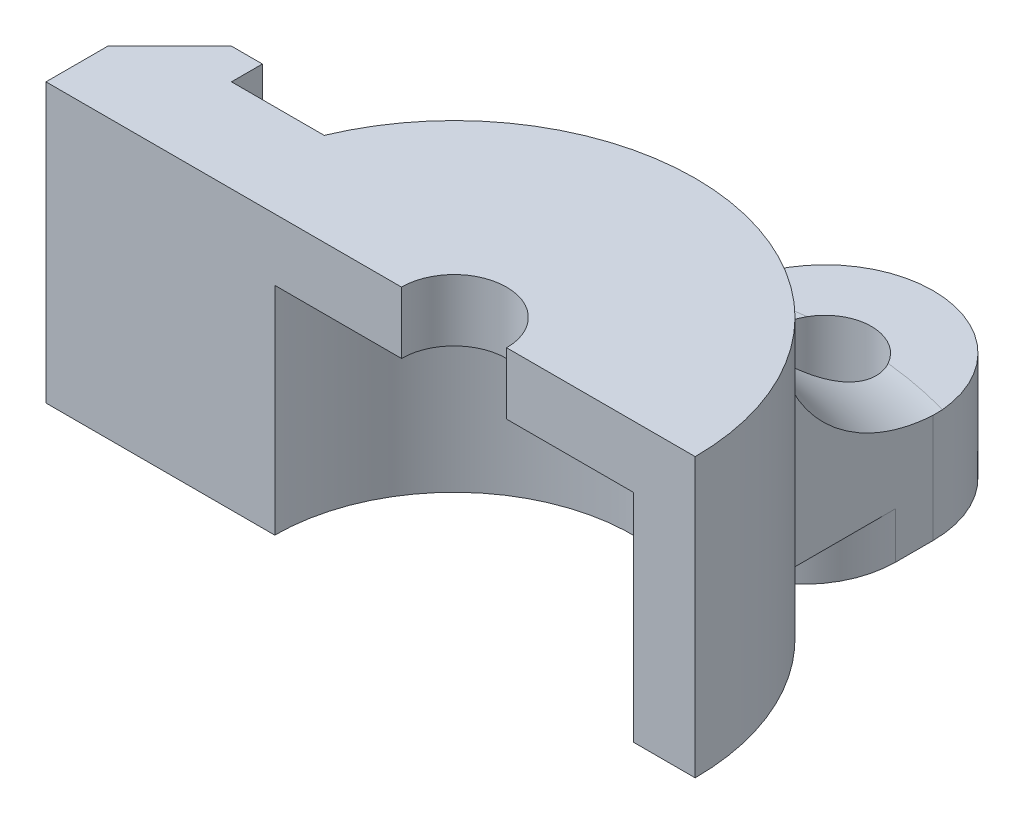
ISO-10303-21;
HEADER;
FILE_DESCRIPTION(('STEP AP214'),'2;1');
FILE_NAME('part.step','',(''),(''),'','','');
FILE_SCHEMA(('AUTOMOTIVE_DESIGN { 1 0 10303 214 1 1 1 1 }'));
ENDSEC;
DATA;
#1=APPLICATION_CONTEXT('core data for automotive mechanical design processes');
#2=APPLICATION_PROTOCOL_DEFINITION('international standard','automotive_design',2000,#1);
#3=PRODUCT_CONTEXT('',#1,'mechanical');
#4=PRODUCT('Part','Part','',(#3));
#5=PRODUCT_RELATED_PRODUCT_CATEGORY('part','',(#4));
#6=PRODUCT_DEFINITION_FORMATION('','',#4);
#7=PRODUCT_DEFINITION_CONTEXT('part definition',#1,'design');
#8=PRODUCT_DEFINITION('design','',#6,#7);
#9=PRODUCT_DEFINITION_SHAPE('','',#8);
#10=(LENGTH_UNIT() NAMED_UNIT(*) SI_UNIT(.MILLI.,.METRE.));
#11=(NAMED_UNIT(*) PLANE_ANGLE_UNIT() SI_UNIT($,.RADIAN.));
#12=(NAMED_UNIT(*) SI_UNIT($,.STERADIAN.) SOLID_ANGLE_UNIT());
#13=UNCERTAINTY_MEASURE_WITH_UNIT(LENGTH_MEASURE(1.E-05),#10,'distance_accuracy_value','');
#14=(GEOMETRIC_REPRESENTATION_CONTEXT(3) GLOBAL_UNCERTAINTY_ASSIGNED_CONTEXT((#13)) GLOBAL_UNIT_ASSIGNED_CONTEXT((#10,
#11,#12)) REPRESENTATION_CONTEXT('',''));
#15=CARTESIAN_POINT('',(0.,0.,0.));
#16=DIRECTION('',(0.,0.,1.));
#17=DIRECTION('',(1.,0.,0.));
#18=AXIS2_PLACEMENT_3D('',#15,#16,#17);
#19=CARTESIAN_POINT('',(0.,7.,0.));
#20=DIRECTION('',(0.,-1.,0.));
#21=DIRECTION('',(0.,0.,-1.));
#22=AXIS2_PLACEMENT_3D('',#19,#20,#21);
#23=CYLINDRICAL_SURFACE('',#22,7.8);
#24=CARTESIAN_POINT('',(0.,0.,0.));
#25=DIRECTION('',(0.,1.,0.));
#26=DIRECTION('',(0.,0.,1.));
#27=AXIS2_PLACEMENT_3D('',#24,#25,#26);
#28=CIRCLE('',#27,7.8);
#29=CARTESIAN_POINT('',(-3.5,0.,-6.97065276713738));
#30=VERTEX_POINT('',#29);
#31=CARTESIAN_POINT('',(-7.2,0.,-3.));
#32=VERTEX_POINT('',#31);
#33=EDGE_CURVE('E205',#30,#32,#28,.T.);
#34=ORIENTED_EDGE('',*,*,#33,.T.);
#35=DIRECTION('',(0.,1.,0.));
#36=VECTOR('',#35,1.);
#37=CARTESIAN_POINT('',(-7.2,-7.21110255092798,-3.));
#38=LINE('',#37,#36);
#39=CARTESIAN_POINT('',(-7.2,9.,-3.));
#40=VERTEX_POINT('',#39);
#41=EDGE_CURVE('E189',#32,#40,#38,.T.);
#42=ORIENTED_EDGE('',*,*,#41,.T.);
#43=CARTESIAN_POINT('',(0.,9.,0.));
#44=DIRECTION('',(0.,1.,0.));
#45=DIRECTION('',(0.,0.,1.));
#46=AXIS2_PLACEMENT_3D('',#43,#44,#45);
#47=CIRCLE('',#46,7.8);
#48=CARTESIAN_POINT('',(7.8,9.,0.));
#49=VERTEX_POINT('',#48);
#50=EDGE_CURVE('E203',#49,#40,#47,.T.);
#51=ORIENTED_EDGE('',*,*,#50,.F.);
#52=DIRECTION('',(0.,-1.,0.));
#53=VECTOR('',#52,1.);
#54=CARTESIAN_POINT('',(7.8,7.,0.));
#55=LINE('',#54,#53);
#56=CARTESIAN_POINT('',(7.8,0.,0.));
#57=VERTEX_POINT('',#56);
#58=EDGE_CURVE('E250',#49,#57,#55,.T.);
#59=ORIENTED_EDGE('',*,*,#58,.T.);
#60=CARTESIAN_POINT('',(3.5,0.,-6.97065276713738));
#61=VERTEX_POINT('',#60);
#62=EDGE_CURVE('E252',#57,#61,#28,.T.);
#63=ORIENTED_EDGE('',*,*,#62,.T.);
#64=DIRECTION('',(0.,-1.,0.));
#65=VECTOR('',#64,1.);
#66=CARTESIAN_POINT('',(3.5,2.,-6.97065276713738));
#67=LINE('',#66,#65);
#68=CARTESIAN_POINT('',(3.5,7.,-6.97065276713738));
#69=VERTEX_POINT('',#68);
#70=EDGE_CURVE('E658',#69,#61,#67,.T.);
#71=ORIENTED_EDGE('',*,*,#70,.F.);
#72=CARTESIAN_POINT('',(0.,7.,0.));
#73=DIRECTION('',(0.,-1.,0.));
#74=DIRECTION('',(0.,0.,-1.));
#75=AXIS2_PLACEMENT_3D('',#72,#73,#74);
#76=CIRCLE('',#75,7.8);
#77=CARTESIAN_POINT('',(-3.5,7.,-6.97065276713738));
#78=VERTEX_POINT('',#77);
#79=EDGE_CURVE('E282',#69,#78,#76,.F.);
#80=ORIENTED_EDGE('',*,*,#79,.T.);
#81=DIRECTION('',(0.,-1.,0.));
#82=VECTOR('',#81,1.);
#83=CARTESIAN_POINT('',(-3.5,2.,-6.97065276713738));
#84=LINE('',#83,#82);
#85=EDGE_CURVE('E236',#78,#30,#84,.T.);
#86=ORIENTED_EDGE('',*,*,#85,.T.);
#87=EDGE_LOOP('',(#34,#42,#51,#59,#63,#71,#80,#86));
#88=FACE_BOUND('',#87,.T.);
#89=ADVANCED_FACE('F42',(#88),#23,.T.);
#90=CARTESIAN_POINT('',(-7.8,7.,0.));
#91=DIRECTION('',(0.,0.,-1.));
#92=DIRECTION('',(-1.,0.,0.));
#93=AXIS2_PLACEMENT_3D('',#90,#91,#92);
#94=PLANE('',#93);
#95=DIRECTION('',(1.,0.,0.));
#96=VECTOR('',#95,1.);
#97=CARTESIAN_POINT('',(-7.8,0.,0.));
#98=LINE('',#97,#96);
#99=CARTESIAN_POINT('',(-13.2,0.,0.));
#100=VERTEX_POINT('',#99);
#101=CARTESIAN_POINT('',(-5.8,0.,0.));
#102=VERTEX_POINT('',#101);
#103=EDGE_CURVE('E256',#100,#102,#98,.T.);
#104=ORIENTED_EDGE('',*,*,#103,.T.);
#105=DIRECTION('',(0.,-1.,0.));
#106=VECTOR('',#105,1.);
#107=CARTESIAN_POINT('',(-5.8,7.,0.));
#108=LINE('',#107,#106);
#109=CARTESIAN_POINT('',(-5.8,7.,0.));
#110=VERTEX_POINT('',#109);
#111=EDGE_CURVE('E271',#110,#102,#108,.T.);
#112=ORIENTED_EDGE('',*,*,#111,.F.);
#113=DIRECTION('',(1.,0.,0.));
#114=VECTOR('',#113,1.);
#115=CARTESIAN_POINT('',(-7.8,7.,0.));
#116=LINE('',#115,#114);
#117=CARTESIAN_POINT('',(-1.7,7.,0.));
#118=VERTEX_POINT('',#117);
#119=EDGE_CURVE('E233',#110,#118,#116,.T.);
#120=ORIENTED_EDGE('',*,*,#119,.T.);
#121=DIRECTION('',(0.,-1.,0.));
#122=VECTOR('',#121,1.);
#123=CARTESIAN_POINT('',(-1.7,9.,0.));
#124=LINE('',#123,#122);
#125=CARTESIAN_POINT('',(-1.7,9.,0.));
#126=VERTEX_POINT('',#125);
#127=EDGE_CURVE('E242',#126,#118,#124,.T.);
#128=ORIENTED_EDGE('',*,*,#127,.F.);
#129=DIRECTION('',(1.,0.,0.));
#130=VECTOR('',#129,1.);
#131=CARTESIAN_POINT('',(-7.8,9.,0.));
#132=LINE('',#131,#130);
#133=CARTESIAN_POINT('',(-13.2,9.,0.));
#134=VERTEX_POINT('',#133);
#135=EDGE_CURVE('E214',#134,#126,#132,.T.);
#136=ORIENTED_EDGE('',*,*,#135,.F.);
#137=DIRECTION('',(0.,1.,0.));
#138=VECTOR('',#137,1.);
#139=CARTESIAN_POINT('',(-13.2,-7.21110255092798,0.));
#140=LINE('',#139,#138);
#141=EDGE_CURVE('E729',#100,#134,#140,.T.);
#142=ORIENTED_EDGE('',*,*,#141,.F.);
#143=EDGE_LOOP('',(#104,#112,#120,#128,#136,#142));
#144=FACE_BOUND('',#143,.T.);
#145=ADVANCED_FACE('F387',(#144),#94,.F.);
#146=CARTESIAN_POINT('',(0.,7.,0.));
#147=DIRECTION('',(0.,-1.,0.));
#148=DIRECTION('',(0.,0.,-1.));
#149=AXIS2_PLACEMENT_3D('',#146,#147,#148);
#150=CYLINDRICAL_SURFACE('',#149,5.8);
#151=CARTESIAN_POINT('',(0.,0.,0.));
#152=DIRECTION('',(0.,-1.,0.));
#153=DIRECTION('',(0.,0.,1.));
#154=AXIS2_PLACEMENT_3D('',#151,#152,#153);
#155=CIRCLE('',#154,5.8);
#156=CARTESIAN_POINT('',(5.8,0.,0.));
#157=VERTEX_POINT('',#156);
#158=EDGE_CURVE('E260',#102,#157,#155,.T.);
#159=ORIENTED_EDGE('',*,*,#158,.T.);
#160=DIRECTION('',(0.,-1.,0.));
#161=VECTOR('',#160,1.);
#162=CARTESIAN_POINT('',(5.8,7.,0.));
#163=LINE('',#162,#161);
#164=CARTESIAN_POINT('',(5.8,7.,0.));
#165=VERTEX_POINT('',#164);
#166=EDGE_CURVE('E267',#165,#157,#163,.T.);
#167=ORIENTED_EDGE('',*,*,#166,.F.);
#168=CARTESIAN_POINT('',(0.,7.,0.));
#169=DIRECTION('',(0.,-1.,0.));
#170=DIRECTION('',(0.,0.,1.));
#171=AXIS2_PLACEMENT_3D('',#168,#169,#170);
#172=CIRCLE('',#171,5.8);
#173=EDGE_CURVE('E246',#110,#165,#172,.T.);
#174=ORIENTED_EDGE('',*,*,#173,.F.);
#175=ORIENTED_EDGE('',*,*,#111,.T.);
#176=EDGE_LOOP('',(#159,#167,#174,#175));
#177=FACE_BOUND('',#176,.T.);
#178=ADVANCED_FACE('F393',(#177),#150,.F.);
#179=CARTESIAN_POINT('',(5.8,7.,0.));
#180=DIRECTION('',(0.,0.,-1.));
#181=DIRECTION('',(-1.,0.,0.));
#182=AXIS2_PLACEMENT_3D('',#179,#180,#181);
#183=PLANE('',#182);
#184=DIRECTION('',(1.,0.,0.));
#185=VECTOR('',#184,1.);
#186=CARTESIAN_POINT('',(5.8,0.,0.));
#187=LINE('',#186,#185);
#188=EDGE_CURVE('E251',#157,#57,#187,.T.);
#189=ORIENTED_EDGE('',*,*,#188,.T.);
#190=ORIENTED_EDGE('',*,*,#58,.F.);
#191=DIRECTION('',(1.,0.,0.));
#192=VECTOR('',#191,1.);
#193=CARTESIAN_POINT('',(7.8,9.,0.));
#194=LINE('',#193,#192);
#195=CARTESIAN_POINT('',(1.7,9.,0.));
#196=VERTEX_POINT('',#195);
#197=EDGE_CURVE('E212',#196,#49,#194,.T.);
#198=ORIENTED_EDGE('',*,*,#197,.F.);
#199=DIRECTION('',(0.,-1.,0.));
#200=VECTOR('',#199,1.);
#201=CARTESIAN_POINT('',(1.7,9.,0.));
#202=LINE('',#201,#200);
#203=CARTESIAN_POINT('',(1.7,7.,0.));
#204=VERTEX_POINT('',#203);
#205=EDGE_CURVE('E232',#196,#204,#202,.T.);
#206=ORIENTED_EDGE('',*,*,#205,.T.);
#207=DIRECTION('',(1.,0.,0.));
#208=VECTOR('',#207,1.);
#209=CARTESIAN_POINT('',(7.8,7.,0.));
#210=LINE('',#209,#208);
#211=EDGE_CURVE('E215',#204,#165,#210,.T.);
#212=ORIENTED_EDGE('',*,*,#211,.T.);
#213=ORIENTED_EDGE('',*,*,#166,.T.);
#214=EDGE_LOOP('',(#189,#190,#198,#206,#212,#213));
#215=FACE_BOUND('',#214,.T.);
#216=ADVANCED_FACE('F398',(#215),#183,.F.);
#217=CARTESIAN_POINT('',(0.,0.,0.));
#218=DIRECTION('',(0.,1.,0.));
#219=DIRECTION('',(0.,0.,1.));
#220=AXIS2_PLACEMENT_3D('',#217,#218,#219);
#221=PLANE('',#220);
#222=ORIENTED_EDGE('',*,*,#62,.F.);
#223=ORIENTED_EDGE('',*,*,#188,.F.);
#224=ORIENTED_EDGE('',*,*,#158,.F.);
#225=ORIENTED_EDGE('',*,*,#103,.F.);
#226=DIRECTION('',(0.,0.,-1.));
#227=VECTOR('',#226,1.);
#228=CARTESIAN_POINT('',(-13.2,0.,-2.));
#229=LINE('',#228,#227);
#230=CARTESIAN_POINT('',(-13.2,0.,-2.));
#231=VERTEX_POINT('',#230);
#232=EDGE_CURVE('E636',#100,#231,#229,.T.);
#233=ORIENTED_EDGE('',*,*,#232,.T.);
#234=DIRECTION('',(0.707106781186547,0.,-0.707106781186548));
#235=VECTOR('',#234,1.);
#236=CARTESIAN_POINT('',(-11.2,0.,-4.));
#237=LINE('',#236,#235);
#238=CARTESIAN_POINT('',(-11.2,0.,-4.));
#239=VERTEX_POINT('',#238);
#240=EDGE_CURVE('E762',#231,#239,#237,.T.);
#241=ORIENTED_EDGE('',*,*,#240,.T.);
#242=DIRECTION('',(1.,0.,0.));
#243=VECTOR('',#242,1.);
#244=CARTESIAN_POINT('',(-10.2,0.,-4.));
#245=LINE('',#244,#243);
#246=CARTESIAN_POINT('',(-10.2,0.,-4.));
#247=VERTEX_POINT('',#246);
#248=EDGE_CURVE('E737',#239,#247,#245,.T.);
#249=ORIENTED_EDGE('',*,*,#248,.T.);
#250=DIRECTION('',(0.,0.,1.));
#251=VECTOR('',#250,1.);
#252=CARTESIAN_POINT('',(-10.2,0.,-4.));
#253=LINE('',#252,#251);
#254=CARTESIAN_POINT('',(-10.2,0.,-3.));
#255=VERTEX_POINT('',#254);
#256=EDGE_CURVE('E732',#247,#255,#253,.T.);
#257=ORIENTED_EDGE('',*,*,#256,.T.);
#258=DIRECTION('',(1.,0.,0.));
#259=VECTOR('',#258,1.);
#260=CARTESIAN_POINT('',(-10.2,0.,-3.));
#261=LINE('',#260,#259);
#262=EDGE_CURVE('E629',#255,#32,#261,.T.);
#263=ORIENTED_EDGE('',*,*,#262,.T.);
#264=ORIENTED_EDGE('',*,*,#33,.F.);
#265=DIRECTION('',(0.,0.,1.));
#266=VECTOR('',#265,1.);
#267=CARTESIAN_POINT('',(-3.5,0.,0.));
#268=LINE('',#267,#266);
#269=CARTESIAN_POINT('',(-3.5,0.,-10.7884197174563));
#270=VERTEX_POINT('',#269);
#271=EDGE_CURVE('E64',#270,#30,#268,.T.);
#272=ORIENTED_EDGE('',*,*,#271,.F.);
#273=CARTESIAN_POINT('',(-0.499999999999999,0.,-10.7884197174563));
#274=DIRECTION('',(0.,1.,0.));
#275=DIRECTION('',(0.,0.,1.));
#276=AXIS2_PLACEMENT_3D('',#273,#274,#275);
#277=CIRCLE('',#276,3.);
#278=CARTESIAN_POINT('',(-0.36111111111111,0.,-7.79163646260733));
#279=VERTEX_POINT('',#278);
#280=EDGE_CURVE('E11',#270,#279,#277,.T.);
#281=ORIENTED_EDGE('',*,*,#280,.T.);
#282=CARTESIAN_POINT('',(0.361111111111112,0.,-7.79163646260733));
#283=VERTEX_POINT('',#282);
#284=EDGE_CURVE('E257',#283,#279,#28,.T.);
#285=ORIENTED_EDGE('',*,*,#284,.F.);
#286=CARTESIAN_POINT('',(0.500000000000001,0.,-10.7884197174563));
#287=DIRECTION('',(0.,1.,0.));
#288=DIRECTION('',(0.,0.,1.));
#289=AXIS2_PLACEMENT_3D('',#286,#287,#288);
#290=CIRCLE('',#289,3.);
#291=CARTESIAN_POINT('',(3.5,0.,-10.7884197174563));
#292=VERTEX_POINT('',#291);
#293=EDGE_CURVE('E51',#283,#292,#290,.T.);
#294=ORIENTED_EDGE('',*,*,#293,.T.);
#295=DIRECTION('',(0.,0.,-1.));
#296=VECTOR('',#295,1.);
#297=CARTESIAN_POINT('',(3.5,0.,0.));
#298=LINE('',#297,#296);
#299=EDGE_CURVE('E58',#61,#292,#298,.T.);
#300=ORIENTED_EDGE('',*,*,#299,.F.);
#301=EDGE_LOOP('',(#222,#223,#224,#225,#233,#241,#249,#257,#263,#264,#272,#281,#285,#294,#300));
#302=FACE_BOUND('',#301,.T.);
#303=ADVANCED_FACE('F404',(#302),#221,.F.);
#304=CARTESIAN_POINT('',(0.,7.,0.));
#305=DIRECTION('',(0.,1.,0.));
#306=DIRECTION('',(0.,0.,1.));
#307=AXIS2_PLACEMENT_3D('',#304,#305,#306);
#308=PLANE('',#307);
#309=ORIENTED_EDGE('',*,*,#119,.F.);
#310=ORIENTED_EDGE('',*,*,#173,.T.);
#311=ORIENTED_EDGE('',*,*,#211,.F.);
#312=CARTESIAN_POINT('',(0.,7.,0.));
#313=DIRECTION('',(0.,-1.,0.));
#314=DIRECTION('',(0.,0.,1.));
#315=AXIS2_PLACEMENT_3D('',#312,#313,#314);
#316=CIRCLE('',#315,1.7);
#317=EDGE_CURVE('E222',#118,#204,#316,.T.);
#318=ORIENTED_EDGE('',*,*,#317,.F.);
#319=EDGE_LOOP('',(#309,#310,#311,#318));
#320=FACE_BOUND('',#319,.T.);
#321=ADVANCED_FACE('F407',(#320),#308,.F.);
#322=CARTESIAN_POINT('',(0.,9.,0.));
#323=DIRECTION('',(0.,-1.,0.));
#324=DIRECTION('',(0.,0.,-1.));
#325=AXIS2_PLACEMENT_3D('',#322,#323,#324);
#326=CYLINDRICAL_SURFACE('',#325,1.7);
#327=ORIENTED_EDGE('',*,*,#317,.T.);
#328=ORIENTED_EDGE('',*,*,#205,.F.);
#329=CARTESIAN_POINT('',(0.,9.,0.));
#330=DIRECTION('',(0.,-1.,0.));
#331=DIRECTION('',(0.,0.,1.));
#332=AXIS2_PLACEMENT_3D('',#329,#330,#331);
#333=CIRCLE('',#332,1.7);
#334=EDGE_CURVE('E219',#126,#196,#333,.T.);
#335=ORIENTED_EDGE('',*,*,#334,.F.);
#336=ORIENTED_EDGE('',*,*,#127,.T.);
#337=EDGE_LOOP('',(#327,#328,#335,#336));
#338=FACE_BOUND('',#337,.T.);
#339=ADVANCED_FACE('F408',(#338),#326,.F.);
#340=CARTESIAN_POINT('',(0.,9.,0.));
#341=DIRECTION('',(0.,1.,0.));
#342=DIRECTION('',(0.,0.,1.));
#343=AXIS2_PLACEMENT_3D('',#340,#341,#342);
#344=PLANE('',#343);
#345=ORIENTED_EDGE('',*,*,#50,.T.);
#346=DIRECTION('',(-1.,0.,0.));
#347=VECTOR('',#346,1.);
#348=CARTESIAN_POINT('',(-10.2,9.,-3.));
#349=LINE('',#348,#347);
#350=CARTESIAN_POINT('',(-10.2,9.,-3.));
#351=VERTEX_POINT('',#350);
#352=EDGE_CURVE('E185',#40,#351,#349,.T.);
#353=ORIENTED_EDGE('',*,*,#352,.T.);
#354=DIRECTION('',(0.,0.,-1.));
#355=VECTOR('',#354,1.);
#356=CARTESIAN_POINT('',(-10.2,9.,-4.));
#357=LINE('',#356,#355);
#358=CARTESIAN_POINT('',(-10.2,9.,-4.));
#359=VERTEX_POINT('',#358);
#360=EDGE_CURVE('E198',#351,#359,#357,.T.);
#361=ORIENTED_EDGE('',*,*,#360,.T.);
#362=DIRECTION('',(-1.,0.,0.));
#363=VECTOR('',#362,1.);
#364=CARTESIAN_POINT('',(-10.2,9.,-4.));
#365=LINE('',#364,#363);
#366=CARTESIAN_POINT('',(-11.2,9.,-4.));
#367=VERTEX_POINT('',#366);
#368=EDGE_CURVE('E754',#359,#367,#365,.T.);
#369=ORIENTED_EDGE('',*,*,#368,.T.);
#370=DIRECTION('',(-0.707106781186547,0.,0.707106781186548));
#371=VECTOR('',#370,1.);
#372=CARTESIAN_POINT('',(-11.2,9.,-4.));
#373=LINE('',#372,#371);
#374=CARTESIAN_POINT('',(-13.2,9.,-2.));
#375=VERTEX_POINT('',#374);
#376=EDGE_CURVE('E752',#367,#375,#373,.T.);
#377=ORIENTED_EDGE('',*,*,#376,.T.);
#378=DIRECTION('',(0.,0.,1.));
#379=VECTOR('',#378,1.);
#380=CARTESIAN_POINT('',(-13.2,9.,-2.));
#381=LINE('',#380,#379);
#382=EDGE_CURVE('E207',#375,#134,#381,.T.);
#383=ORIENTED_EDGE('',*,*,#382,.T.);
#384=ORIENTED_EDGE('',*,*,#135,.T.);
#385=ORIENTED_EDGE('',*,*,#334,.T.);
#386=ORIENTED_EDGE('',*,*,#197,.T.);
#387=EDGE_LOOP('',(#345,#353,#361,#369,#377,#383,#384,#385,#386));
#388=FACE_BOUND('',#387,.T.);
#389=ADVANCED_FACE('F210',(#388),#344,.T.);
#390=CARTESIAN_POINT('',(0.,2.,0.));
#391=DIRECTION('',(0.,-1.,0.));
#392=DIRECTION('',(0.,0.,-1.));
#393=AXIS2_PLACEMENT_3D('',#390,#391,#392);
#394=CYLINDRICAL_SURFACE('',#393,7.8);
#395=CARTESIAN_POINT('',(0.,-1.5,0.));
#396=DIRECTION('',(0.,-1.,0.));
#397=DIRECTION('',(0.,0.,-1.));
#398=AXIS2_PLACEMENT_3D('',#395,#396,#397);
#399=CIRCLE('',#398,7.8);
#400=CARTESIAN_POINT('',(-0.36111111111111,-1.5,-7.79163646260733));
#401=VERTEX_POINT('',#400);
#402=CARTESIAN_POINT('',(0.361111111111112,-1.5,-7.79163646260733));
#403=VERTEX_POINT('',#402);
#404=EDGE_CURVE('E646',#401,#403,#399,.T.);
#405=ORIENTED_EDGE('',*,*,#404,.T.);
#406=DIRECTION('',(0.,-1.,0.));
#407=VECTOR('',#406,1.);
#408=CARTESIAN_POINT('',(0.361111111111112,2.,-7.79163646260733));
#409=LINE('',#408,#407);
#410=EDGE_CURVE('E688',#403,#283,#409,.F.);
#411=ORIENTED_EDGE('',*,*,#410,.T.);
#412=ORIENTED_EDGE('',*,*,#284,.T.);
#413=DIRECTION('',(0.,-1.,0.));
#414=VECTOR('',#413,1.);
#415=CARTESIAN_POINT('',(-0.36111111111111,2.,-7.79163646260733));
#416=LINE('',#415,#414);
#417=EDGE_CURVE('E681',#279,#401,#416,.T.);
#418=ORIENTED_EDGE('',*,*,#417,.T.);
#419=EDGE_LOOP('',(#405,#411,#412,#418));
#420=FACE_BOUND('',#419,.T.);
#421=ADVANCED_FACE('F343',(#420),#394,.F.);
#422=CARTESIAN_POINT('',(-3.5,2.,0.));
#423=DIRECTION('',(1.,0.,0.));
#424=DIRECTION('',(0.,0.,-1.));
#425=AXIS2_PLACEMENT_3D('',#422,#423,#424);
#426=PLANE('',#425);
#427=DIRECTION('',(0.,0.,1.));
#428=VECTOR('',#427,1.);
#429=CARTESIAN_POINT('',(-3.5,-1.5,0.));
#430=LINE('',#429,#428);
#431=CARTESIAN_POINT('',(-3.5,-1.5,-12.));
#432=VERTEX_POINT('',#431);
#433=CARTESIAN_POINT('',(-3.5,-1.5,-10.7884197174563));
#434=VERTEX_POINT('',#433);
#435=EDGE_CURVE('E628',#432,#434,#430,.T.);
#436=ORIENTED_EDGE('',*,*,#435,.T.);
#437=DIRECTION('',(0.,-1.,0.));
#438=VECTOR('',#437,1.);
#439=CARTESIAN_POINT('',(-3.5,2.,-10.7884197174563));
#440=LINE('',#439,#438);
#441=EDGE_CURVE('E693',#434,#270,#440,.F.);
#442=ORIENTED_EDGE('',*,*,#441,.T.);
#443=ORIENTED_EDGE('',*,*,#271,.T.);
#444=ORIENTED_EDGE('',*,*,#85,.F.);
#445=CARTESIAN_POINT('',(-3.5,7.,-6.97065276713738));
#446=CARTESIAN_POINT('',(-3.5,6.86823671626228,-6.9706218991886));
#447=CARTESIAN_POINT('',(-3.5,6.73648547428623,-6.97647967766274));
#448=CARTESIAN_POINT('',(-3.5,6.47405745796886,-6.99974126741131));
#449=CARTESIAN_POINT('',(-3.5,6.34338027407757,-7.01714044928466));
#450=CARTESIAN_POINT('',(-3.5,6.0845976502858,-7.06315539428935));
#451=CARTESIAN_POINT('',(-3.5,5.95648360664042,-7.09172290616116));
#452=CARTESIAN_POINT('',(-3.5,5.7031532246982,-7.15966433827299));
#453=CARTESIAN_POINT('',(-3.5,5.57793707402591,-7.1990389561102));
#454=CARTESIAN_POINT('',(-3.5,5.33140655298456,-7.288024226344));
#455=CARTESIAN_POINT('',(-3.5,5.21008667260468,-7.33761961487014));
#456=CARTESIAN_POINT('',(-3.5,4.9718584250637,-7.44650006056829));
#457=CARTESIAN_POINT('',(-3.5,4.85495174101407,-7.50578876954371));
#458=CARTESIAN_POINT('',(-3.5,4.5117259263191,-7.69735525109701));
#459=CARTESIAN_POINT('',(-3.5,4.29289316035297,-7.84333626331792));
#460=CARTESIAN_POINT('',(-3.5,3.86788502205746,-8.17591703058829));
#461=CARTESIAN_POINT('',(-3.5,3.66318277304708,-8.36438335986996));
#462=CARTESIAN_POINT('',(-3.5,3.28511694545256,-8.77055002971868));
#463=CARTESIAN_POINT('',(-3.5,3.11176534881782,-8.98826149235577));
#464=CARTESIAN_POINT('',(-3.5,2.78615399876281,-9.46735093819537));
#465=CARTESIAN_POINT('',(-3.5,2.63705875204207,-9.73088198912312));
#466=CARTESIAN_POINT('',(-3.5,2.38367485518992,-10.2785772557246));
#467=CARTESIAN_POINT('',(-3.5,2.27936173557937,-10.5627301039187));
#468=CARTESIAN_POINT('',(-3.5,2.14709635179676,-11.0405295466162));
#469=CARTESIAN_POINT('',(-3.5,2.1051805605681,-11.2304212997973));
#470=CARTESIAN_POINT('',(-3.5,2.0417315507288,-11.6133114646566));
#471=CARTESIAN_POINT('',(-3.5,2.02017071620863,-11.8063053048567));
#472=CARTESIAN_POINT('',(-3.5,2.00900811461289,-12.));
#473=B_SPLINE_CURVE_WITH_KNOTS('',3,(#445,#446,#447,#448,#449,#450,#451,#452,#453,#454,#455,
#456,#457,#458,#459,#460,#461,#462,#463,#464,#465,#466,#467,#468,#469,#470,#471,#472),
.UNSPECIFIED.,.F.,.F.,(4,2,2,2,2,2,2,2,2,2,2,2,2,4),(0.,0.395140779767936,0.790123159396702,
1.18341760122884,1.57673743613589,1.96947408277316,2.36235902904348,3.14810405618437,
3.9794809509514,4.81117492239391,5.71550858161135,6.61934747143437,7.20172171769979,
7.78330470680458),.UNSPECIFIED.);
#474=CARTESIAN_POINT('',(-3.5,2.00900811461289,-12.));
#475=VERTEX_POINT('',#474);
#476=EDGE_CURVE('E326',#78,#475,#473,.T.);
#477=ORIENTED_EDGE('',*,*,#476,.T.);
#478=DIRECTION('',(0.,-1.,0.));
#479=VECTOR('',#478,1.);
#480=CARTESIAN_POINT('',(-3.5,2.,-12.));
#481=LINE('',#480,#479);
#482=EDGE_CURVE('E225',#475,#432,#481,.T.);
#483=ORIENTED_EDGE('',*,*,#482,.T.);
#484=EDGE_LOOP('',(#436,#442,#443,#444,#477,#483));
#485=FACE_BOUND('',#484,.T.);
#486=ADVANCED_FACE('F339',(#485),#426,.F.);
#487=CARTESIAN_POINT('',(3.5,2.,0.));
#488=DIRECTION('',(1.,0.,0.));
#489=DIRECTION('',(0.,0.,-1.));
#490=AXIS2_PLACEMENT_3D('',#487,#488,#489);
#491=PLANE('',#490);
#492=ORIENTED_EDGE('',*,*,#299,.T.);
#493=DIRECTION('',(0.,1.,0.));
#494=VECTOR('',#493,1.);
#495=CARTESIAN_POINT('',(3.5,-1.5,-10.7884197174563));
#496=LINE('',#495,#494);
#497=CARTESIAN_POINT('',(3.5,-1.5,-10.7884197174563));
#498=VERTEX_POINT('',#497);
#499=EDGE_CURVE('E677',#292,#498,#496,.F.);
#500=ORIENTED_EDGE('',*,*,#499,.T.);
#501=DIRECTION('',(0.,0.,1.));
#502=VECTOR('',#501,1.);
#503=CARTESIAN_POINT('',(3.5,-1.5,0.));
#504=LINE('',#503,#502);
#505=CARTESIAN_POINT('',(3.5,-1.5,-12.));
#506=VERTEX_POINT('',#505);
#507=EDGE_CURVE('E642',#506,#498,#504,.T.);
#508=ORIENTED_EDGE('',*,*,#507,.F.);
#509=DIRECTION('',(0.,-1.,0.));
#510=VECTOR('',#509,1.);
#511=CARTESIAN_POINT('',(3.5,2.,-12.));
#512=LINE('',#511,#510);
#513=CARTESIAN_POINT('',(3.5,2.00900811461289,-12.));
#514=VERTEX_POINT('',#513);
#515=EDGE_CURVE('E660',#514,#506,#512,.T.);
#516=ORIENTED_EDGE('',*,*,#515,.F.);
#517=CARTESIAN_POINT('',(3.5,2.00900811461289,-12.));
#518=CARTESIAN_POINT('',(3.5,2.01793094000883,-11.8451307273015));
#519=CARTESIAN_POINT('',(3.5,2.03351137485017,-11.6906565412159));
#520=CARTESIAN_POINT('',(3.5,2.07771238803744,-11.3836061783583));
#521=CARTESIAN_POINT('',(3.5,2.10633109733114,-11.2310297327623));
#522=CARTESIAN_POINT('',(3.5,2.17631450990522,-10.9289317281104));
#523=CARTESIAN_POINT('',(3.5,2.21767126825504,-10.7794083266331));
#524=CARTESIAN_POINT('',(3.5,2.31278234073056,-10.4843556267896));
#525=CARTESIAN_POINT('',(3.5,2.36653691907595,-10.3388264136207));
#526=CARTESIAN_POINT('',(3.5,2.486028369042,-10.0528006521842));
#527=CARTESIAN_POINT('',(3.5,2.55176335440607,-9.91230331583284));
#528=CARTESIAN_POINT('',(3.5,2.69479148252029,-9.63725785324691));
#529=CARTESIAN_POINT('',(3.5,2.77208860264163,-9.5027117949684));
#530=CARTESIAN_POINT('',(3.5,2.93772315645795,-9.24060118500103));
#531=CARTESIAN_POINT('',(3.5,3.02606013838755,-9.11303634793856));
#532=CARTESIAN_POINT('',(3.5,3.21323386715555,-8.86585881396364));
#533=CARTESIAN_POINT('',(3.5,3.31207027930276,-8.74624586376573));
#534=CARTESIAN_POINT('',(3.5,3.51974488357441,-8.51585413860501));
#535=CARTESIAN_POINT('',(3.5,3.628591309825,-8.40508277908586));
#536=CARTESIAN_POINT('',(3.5,3.85552201256424,-8.1935349591479));
#537=CARTESIAN_POINT('',(3.5,3.97360231487143,-8.09275424073421));
#538=CARTESIAN_POINT('',(3.5,4.21839874176892,-7.90210149306975));
#539=CARTESIAN_POINT('',(3.5,4.34512042100704,-7.81223658566191));
#540=CARTESIAN_POINT('',(3.5,4.60623899141991,-7.64458743580362));
#541=CARTESIAN_POINT('',(3.5,4.74063169205117,-7.56679668222845));
#542=CARTESIAN_POINT('',(3.5,5.00838216858371,-7.4283258090906));
#543=CARTESIAN_POINT('',(3.5,5.1413678441795,-7.36692635185127));
#544=CARTESIAN_POINT('',(3.5,5.41235971797762,-7.25663422379488));
#545=CARTESIAN_POINT('',(3.5,5.55036312917021,-7.20773472774493));
#546=CARTESIAN_POINT('',(3.5,5.8300735838419,-7.12324804357175));
#547=CARTESIAN_POINT('',(3.5,5.97177225104917,-7.08763314570175));
#548=CARTESIAN_POINT('',(3.5,6.25786721606293,-7.03019911293064));
#549=CARTESIAN_POINT('',(3.5,6.40226153651191,-7.00837024552492));
#550=CARTESIAN_POINT('',(3.5,6.62257307414056,-6.98597144819146));
#551=CARTESIAN_POINT('',(3.5,6.69799630393872,-6.98022623117015));
#552=CARTESIAN_POINT('',(3.5,6.84894238794852,-6.97256856610466));
#553=CARTESIAN_POINT('',(3.5,6.92446499949557,-6.97065133229729));
#554=CARTESIAN_POINT('',(3.5,7.,-6.97065276713738));
#555=B_SPLINE_CURVE_WITH_KNOTS('',3,(#517,#518,#519,#520,#521,#522,#523,#524,#525,#526,#527,
#528,#529,#530,#531,#532,#533,#534,#535,#536,#537,#538,#539,#540,#541,#542,#543,#544,#545,#546,
#547,#548,#549,#550,#551,#552,#553,#554),.UNSPECIFIED.,.F.,.F.,(4,2,2,2,2,2,2,2,2,2,2,2,2,2,2,2,
2,2,4),(0.,0.465219970828406,0.930373272791159,1.39523703649794,1.86011070819743,
2.32491125093734,2.78987205422154,3.25481383693627,3.71974080310915,4.18505369350236,
4.65016740790594,5.11558296656314,5.58074666600968,6.01957744290483,6.45816809498287,
6.89583872571925,7.33320002832309,7.56004000159088,7.78659620040014),.UNSPECIFIED.);
#556=EDGE_CURVE('E319',#514,#69,#555,.T.);
#557=ORIENTED_EDGE('',*,*,#556,.T.);
#558=ORIENTED_EDGE('',*,*,#70,.T.);
#559=EDGE_LOOP('',(#492,#500,#508,#516,#557,#558));
#560=FACE_BOUND('',#559,.T.);
#561=ADVANCED_FACE('F342',(#560),#491,.T.);
#562=CARTESIAN_POINT('',(0.,2.,-12.));
#563=DIRECTION('',(0.,-1.,0.));
#564=DIRECTION('',(0.,0.,-1.));
#565=AXIS2_PLACEMENT_3D('',#562,#563,#564);
#566=CYLINDRICAL_SURFACE('',#565,1.5);
#567=CARTESIAN_POINT('',(0.,2.,-12.));
#568=DIRECTION('',(0.,-1.,0.));
#569=DIRECTION('',(0.,0.,-1.));
#570=AXIS2_PLACEMENT_3D('',#567,#568,#569);
#571=CIRCLE('',#570,1.5);
#572=CARTESIAN_POINT('',(-1.30875252042631,2.,-12.7329166666667));
#573=VERTEX_POINT('',#572);
#574=CARTESIAN_POINT('',(1.30875252042631,2.,-12.7329166666667));
#575=VERTEX_POINT('',#574);
#576=EDGE_CURVE('E623',#573,#575,#571,.T.);
#577=ORIENTED_EDGE('',*,*,#576,.F.);
#578=CARTESIAN_POINT('',(-1.30875252042631,2.,-12.7329166666667));
#579=CARTESIAN_POINT('',(-1.32875174538573,1.99999952994558,-12.6972047949433));
#580=CARTESIAN_POINT('',(-1.34727914114004,2.00033674474429,-12.6606893996074));
#581=CARTESIAN_POINT('',(-1.38128595752744,2.00178556769655,-12.5862799273691));
#582=CARTESIAN_POINT('',(-1.39676530197976,2.00289719520207,-12.5483858160361));
#583=CARTESIAN_POINT('',(-1.43841618747054,2.00753584829923,-12.4331389770261));
#584=CARTESIAN_POINT('',(-1.45988369410719,2.01236583518955,-12.3540729273001));
#585=CARTESIAN_POINT('',(-1.4896633170332,2.02603763171077,-12.1938070322853));
#586=CARTESIAN_POINT('',(-1.49796394158143,2.03488293716713,-12.1126053858547));
#587=CARTESIAN_POINT('',(-1.50137202279643,2.05675345860904,-11.9505117862413));
#588=CARTESIAN_POINT('',(-1.49648317962454,2.0697775013922,-11.8696197525758));
#589=CARTESIAN_POINT('',(-1.47396288837896,2.09978235603457,-11.7103205249644));
#590=CARTESIAN_POINT('',(-1.4563188009529,2.1167670812725,-11.6319158763093));
#591=CARTESIAN_POINT('',(-1.40909832876559,2.15405650233442,-11.4796108956089));
#592=CARTESIAN_POINT('',(-1.37951687163571,2.17436260727886,-11.4057124937204));
#593=CARTESIAN_POINT('',(-1.30776078232382,2.21834593915317,-11.2606634478528));
#594=CARTESIAN_POINT('',(-1.26505301738167,2.24213772884833,-11.1898117563012));
#595=CARTESIAN_POINT('',(-1.16883778875848,2.2908588384061,-11.0562852960651));
#596=CARTESIAN_POINT('',(-1.11532547347188,2.31578866537984,-10.9936142216415));
#597=CARTESIAN_POINT('',(-0.995028220471856,2.36656942558473,-10.8741491834907));
#598=CARTESIAN_POINT('',(-0.927628534705959,2.39238243353168,-10.8179554870098));
#599=CARTESIAN_POINT('',(-0.783275829991527,2.44091847386286,-10.7177380676374));
#600=CARTESIAN_POINT('',(-0.706322342379554,2.46364135454568,-10.6737149421176));
#601=CARTESIAN_POINT('',(-0.546513041479579,2.50284825292664,-10.6004075187056));
#602=CARTESIAN_POINT('',(-0.463843504709733,2.51946907342423,-10.5707944576239));
#603=CARTESIAN_POINT('',(-0.293506450554873,2.54483175058378,-10.5263756942753));
#604=CARTESIAN_POINT('',(-0.205846894507631,2.55358580332551,-10.5115470673472));
#605=CARTESIAN_POINT('',(-0.040319044225079,2.5612587945388,-10.4985481257678));
#606=CARTESIAN_POINT('',(0.0373521278317354,2.56130164374795,-10.4984742001832));
#607=CARTESIAN_POINT('',(0.191458197041567,2.554343752325,-10.5102642206049));
#608=CARTESIAN_POINT('',(0.267893102111498,2.54734305681713,-10.5221280901322));
#609=CARTESIAN_POINT('',(0.413275893041063,2.52774291759005,-10.5562243877754));
#610=CARTESIAN_POINT('',(0.482405964111141,2.51545904646043,-10.5778754712296));
#611=CARTESIAN_POINT('',(0.616074998501904,2.48663823085765,-10.6304691816413));
#612=CARTESIAN_POINT('',(0.680612556703593,2.47009999180567,-10.661414637302));
#613=CARTESIAN_POINT('',(0.810196105051083,2.43236864968078,-10.7352145368303));
#614=CARTESIAN_POINT('',(0.87465327604891,2.41087606839001,-10.778947776398));
#615=CARTESIAN_POINT('',(0.995725370750387,2.36620511197639,-10.8754853999187));
#616=CARTESIAN_POINT('',(1.05233586183624,2.34302579519355,-10.9282948736462));
#617=CARTESIAN_POINT('',(1.16280914400061,2.29389686049915,-11.0485365910331));
#618=CARTESIAN_POINT('',(1.21560179480489,2.26793609629646,-11.1169529013762));
#619=CARTESIAN_POINT('',(1.30892048542912,2.21781055501689,-11.2623104582947));
#620=CARTESIAN_POINT('',(1.34944482303681,2.19364602751609,-11.3392528858363));
#621=CARTESIAN_POINT('',(1.41713906284265,2.14844762902451,-11.5005686262464));
#622=CARTESIAN_POINT('',(1.44418561611176,2.12744386001347,-11.5850025317398));
#623=CARTESIAN_POINT('',(1.48304900939894,2.08997511700109,-11.7582650579149));
#624=CARTESIAN_POINT('',(1.49487350474603,2.07350786481673,-11.8470914462132));
#625=CARTESIAN_POINT('',(1.50220724395192,2.04656224285115,-12.0204736453106));
#626=CARTESIAN_POINT('',(1.49871118650103,2.03576830834025,-12.1049394405668));
#627=CARTESIAN_POINT('',(1.47744914655586,2.01862047520958,-12.2725121273169));
#628=CARTESIAN_POINT('',(1.45969085058539,2.01226418840208,-12.3556197261897));
#629=CARTESIAN_POINT('',(1.41937864763419,2.00511587408926,-12.4881250578592));
#630=CARTESIAN_POINT('',(1.40094132897762,2.00313969048905,-12.5387543637571));
#631=CARTESIAN_POINT('',(1.35876374737589,2.0005807004931,-12.6376927820155));
#632=CARTESIAN_POINT('',(1.33503224803579,1.99999560982957,-12.6860055702234));
#633=CARTESIAN_POINT('',(1.30875252042631,2.,-12.7329166666667));
#634=B_SPLINE_CURVE_WITH_KNOTS('',3,(#578,#579,#580,#581,#582,#583,#584,#585,#586,#587,#588,
#589,#590,#591,#592,#593,#594,#595,#596,#597,#598,#599,#600,#601,#602,#603,#604,#605,#606,#607,
#608,#609,#610,#611,#612,#613,#614,#615,#616,#617,#618,#619,#620,#621,#622,#623,#624,#625,#626,
#627,#628,#629,#630,#631,#632,#633),.UNSPECIFIED.,.F.,.F.,(4,2,2,2,2,2,2,2,2,2,2,2,2,2,2,2,2,2,
2,2,2,2,2,2,2,2,2,4),(0.,0.122718980297179,0.245441027354014,0.490380248433288,
0.735533129240645,0.980617242232678,1.22594454601814,1.47137620302851,1.72850853802644,
1.98575659188071,2.25885922293008,2.53197525637475,2.79852809701416,3.06466697648896,
3.29644382648485,3.52821919162012,3.74774066013927,3.96732900691355,4.20877476275166,
4.45035636108353,4.71980371295267,4.98928843317012,5.26119615347351,5.53296707510656,
5.78736383031395,6.04162357227662,6.20307362173688,6.36425837574519),.UNSPECIFIED.);
#635=EDGE_CURVE('E286',#573,#575,#634,.T.);
#636=ORIENTED_EDGE('',*,*,#635,.T.);
#637=EDGE_LOOP('',(#577,#636));
#638=FACE_BOUND('',#637,.T.);
#639=CARTESIAN_POINT('',(0.,-1.5,-12.));
#640=DIRECTION('',(0.,-1.,0.));
#641=DIRECTION('',(0.,0.,-1.));
#642=AXIS2_PLACEMENT_3D('',#639,#640,#641);
#643=CIRCLE('',#642,1.5);
#644=CARTESIAN_POINT('',(0.,-1.5,-13.5));
#645=VERTEX_POINT('',#644);
#646=EDGE_CURVE('E626',#645,#645,#643,.T.);
#647=ORIENTED_EDGE('',*,*,#646,.T.);
#648=EDGE_LOOP('',(#647));
#649=FACE_BOUND('',#648,.T.);
#650=ADVANCED_FACE('F302',(#638,#649),#566,.F.);
#651=CARTESIAN_POINT('',(0.,2.,-12.));
#652=DIRECTION('',(0.,-1.,0.));
#653=DIRECTION('',(0.,0.,-1.));
#654=AXIS2_PLACEMENT_3D('',#651,#652,#653);
#655=CYLINDRICAL_SURFACE('',#654,3.5);
#656=ORIENTED_EDGE('',*,*,#515,.T.);
#657=CARTESIAN_POINT('',(0.,-1.5,-12.));
#658=DIRECTION('',(0.,-1.,0.));
#659=DIRECTION('',(0.,0.,-1.));
#660=AXIS2_PLACEMENT_3D('',#657,#658,#659);
#661=CIRCLE('',#660,3.5);
#662=EDGE_CURVE('E634',#432,#506,#661,.T.);
#663=ORIENTED_EDGE('',*,*,#662,.F.);
#664=ORIENTED_EDGE('',*,*,#482,.F.);
#665=CARTESIAN_POINT('',(-3.5,2.00900811461289,-12.));
#666=CARTESIAN_POINT('',(-3.50000073679333,2.0059848239925,-12.052773025363));
#667=CARTESIAN_POINT('',(-3.49880802205714,2.00372250246168,-12.1055136973597));
#668=CARTESIAN_POINT('',(-3.49403568819285,2.00071979674059,-12.2109303640625));
#669=CARTESIAN_POINT('',(-3.49045606773146,1.99997941340044,-12.2636063587325));
#670=CARTESIAN_POINT('',(-3.48568299440727,2.,-12.31625));
#671=B_SPLINE_CURVE_WITH_KNOTS('',3,(#665,#666,#667,#668,#669,#670),.UNSPECIFIED.,.F.,.F.,(4,2,
4),(0.,0.158407930193981,0.316815948871889),.UNSPECIFIED.);
#672=CARTESIAN_POINT('',(-3.48568299440726,2.,-12.31625));
#673=VERTEX_POINT('',#672);
#674=EDGE_CURVE('E333',#475,#673,#671,.T.);
#675=ORIENTED_EDGE('',*,*,#674,.T.);
#676=CARTESIAN_POINT('',(0.,2.,-12.));
#677=DIRECTION('',(0.,-1.,0.));
#678=DIRECTION('',(0.,0.,-1.));
#679=AXIS2_PLACEMENT_3D('',#676,#677,#678);
#680=CIRCLE('',#679,3.5);
#681=CARTESIAN_POINT('',(3.48568299440727,2.,-12.31625));
#682=VERTEX_POINT('',#681);
#683=EDGE_CURVE('E652',#673,#682,#680,.T.);
#684=ORIENTED_EDGE('',*,*,#683,.T.);
#685=CARTESIAN_POINT('',(3.48568299440727,2.,-12.31625));
#686=CARTESIAN_POINT('',(3.49045606773146,1.99997941340044,-12.2636063587325));
#687=CARTESIAN_POINT('',(3.49403568819285,2.00071979674059,-12.2109303640625));
#688=CARTESIAN_POINT('',(3.49880802205715,2.00372250246168,-12.1055136973597));
#689=CARTESIAN_POINT('',(3.50000073679334,2.00598482399249,-12.052773025363));
#690=CARTESIAN_POINT('',(3.5,2.00900811461288,-12.));
#691=B_SPLINE_CURVE_WITH_KNOTS('',3,(#685,#686,#687,#688,#689,#690),.UNSPECIFIED.,.F.,.F.,(4,2,
4),(0.,0.15840801867791,0.316815948871891),.UNSPECIFIED.);
#692=EDGE_CURVE('E295',#682,#514,#691,.T.);
#693=ORIENTED_EDGE('',*,*,#692,.T.);
#694=EDGE_LOOP('',(#656,#663,#664,#675,#684,#693));
#695=FACE_BOUND('',#694,.T.);
#696=ADVANCED_FACE('F345',(#695),#655,.T.);
#697=CARTESIAN_POINT('',(0.,2.,0.));
#698=DIRECTION('',(0.,-1.,0.));
#699=DIRECTION('',(0.,0.,-1.));
#700=AXIS2_PLACEMENT_3D('',#697,#698,#699);
#701=PLANE('',#700);
#702=ORIENTED_EDGE('',*,*,#683,.F.);
#703=CARTESIAN_POINT('',(0.,2.,0.));
#704=DIRECTION('',(0.,-1.,0.));
#705=DIRECTION('',(0.,0.,-1.));
#706=AXIS2_PLACEMENT_3D('',#703,#704,#705);
#707=CIRCLE('',#706,12.8);
#708=EDGE_CURVE('E278',#673,#573,#707,.T.);
#709=ORIENTED_EDGE('',*,*,#708,.T.);
#710=ORIENTED_EDGE('',*,*,#576,.T.);
#711=CARTESIAN_POINT('',(0.,2.,0.));
#712=DIRECTION('',(0.,-1.,0.));
#713=DIRECTION('',(0.,0.,-1.));
#714=AXIS2_PLACEMENT_3D('',#711,#712,#713);
#715=CIRCLE('',#714,12.8);
#716=EDGE_CURVE('E275',#575,#682,#715,.T.);
#717=ORIENTED_EDGE('',*,*,#716,.T.);
#718=EDGE_LOOP('',(#702,#709,#710,#717));
#719=FACE_BOUND('',#718,.T.);
#720=ADVANCED_FACE('F348',(#719),#701,.F.);
#721=CARTESIAN_POINT('',(0.,-1.5,0.));
#722=DIRECTION('',(0.,-1.,0.));
#723=DIRECTION('',(0.,0.,-1.));
#724=AXIS2_PLACEMENT_3D('',#721,#722,#723);
#725=PLANE('',#724);
#726=ORIENTED_EDGE('',*,*,#646,.F.);
#727=EDGE_LOOP('',(#726));
#728=FACE_BOUND('',#727,.T.);
#729=ORIENTED_EDGE('',*,*,#507,.T.);
#730=CARTESIAN_POINT('',(0.500000000000001,-1.5,-10.7884197174563));
#731=DIRECTION('',(0.,-1.,0.));
#732=DIRECTION('',(0.,0.,-1.));
#733=AXIS2_PLACEMENT_3D('',#730,#731,#732);
#734=CIRCLE('',#733,3.);
#735=EDGE_CURVE('E676',#498,#403,#734,.T.);
#736=ORIENTED_EDGE('',*,*,#735,.T.);
#737=ORIENTED_EDGE('',*,*,#404,.F.);
#738=CARTESIAN_POINT('',(-0.499999999999999,-1.5,-10.7884197174563));
#739=DIRECTION('',(0.,-1.,0.));
#740=DIRECTION('',(0.,0.,-1.));
#741=AXIS2_PLACEMENT_3D('',#738,#739,#740);
#742=CIRCLE('',#741,3.);
#743=EDGE_CURVE('E672',#401,#434,#742,.T.);
#744=ORIENTED_EDGE('',*,*,#743,.T.);
#745=ORIENTED_EDGE('',*,*,#435,.F.);
#746=ORIENTED_EDGE('',*,*,#662,.T.);
#747=EDGE_LOOP('',(#729,#736,#737,#744,#745,#746));
#748=FACE_BOUND('',#747,.T.);
#749=ADVANCED_FACE('F311',(#728,#748),#725,.T.);
#750=CARTESIAN_POINT('',(0.,7.,0.));
#751=DIRECTION('',(0.,-1.,0.));
#752=DIRECTION('',(0.,0.,-1.));
#753=AXIS2_PLACEMENT_3D('',#750,#751,#752);
#754=TOROIDAL_SURFACE('',#753,12.8,5.);
#755=ORIENTED_EDGE('',*,*,#476,.F.);
#756=ORIENTED_EDGE('',*,*,#79,.F.);
#757=ORIENTED_EDGE('',*,*,#556,.F.);
#758=ORIENTED_EDGE('',*,*,#692,.F.);
#759=ORIENTED_EDGE('',*,*,#716,.F.);
#760=ORIENTED_EDGE('',*,*,#635,.F.);
#761=ORIENTED_EDGE('',*,*,#708,.F.);
#762=ORIENTED_EDGE('',*,*,#674,.F.);
#763=EDGE_LOOP('',(#755,#756,#757,#758,#759,#760,#761,#762));
#764=FACE_BOUND('',#763,.T.);
#765=ADVANCED_FACE('F306',(#764),#754,.F.);
#766=CARTESIAN_POINT('',(0.500000000000001,2.,-10.7884197174563));
#767=DIRECTION('',(0.,-1.,0.));
#768=DIRECTION('',(0.,0.,-1.));
#769=AXIS2_PLACEMENT_3D('',#766,#767,#768);
#770=CYLINDRICAL_SURFACE('',#769,3.);
#771=ORIENTED_EDGE('',*,*,#293,.F.);
#772=ORIENTED_EDGE('',*,*,#410,.F.);
#773=ORIENTED_EDGE('',*,*,#735,.F.);
#774=ORIENTED_EDGE('',*,*,#499,.F.);
#775=EDGE_LOOP('',(#771,#772,#773,#774));
#776=FACE_BOUND('',#775,.T.);
#777=ADVANCED_FACE('F310',(#776),#770,.T.);
#778=CARTESIAN_POINT('',(-0.499999999999999,2.,-10.7884197174563));
#779=DIRECTION('',(0.,-1.,0.));
#780=DIRECTION('',(0.,0.,-1.));
#781=AXIS2_PLACEMENT_3D('',#778,#779,#780);
#782=CYLINDRICAL_SURFACE('',#781,3.);
#783=ORIENTED_EDGE('',*,*,#280,.F.);
#784=ORIENTED_EDGE('',*,*,#441,.F.);
#785=ORIENTED_EDGE('',*,*,#743,.F.);
#786=ORIENTED_EDGE('',*,*,#417,.F.);
#787=EDGE_LOOP('',(#783,#784,#785,#786));
#788=FACE_BOUND('',#787,.T.);
#789=ADVANCED_FACE('F44',(#788),#782,.T.);
#790=CARTESIAN_POINT('',(-13.2,-7.21110255092798,-2.));
#791=DIRECTION('',(-1.,0.,0.));
#792=DIRECTION('',(0.,0.,1.));
#793=AXIS2_PLACEMENT_3D('',#790,#791,#792);
#794=PLANE('',#793);
#795=ORIENTED_EDGE('',*,*,#232,.F.);
#796=ORIENTED_EDGE('',*,*,#141,.T.);
#797=ORIENTED_EDGE('',*,*,#382,.F.);
#798=DIRECTION('',(0.,1.,0.));
#799=VECTOR('',#798,1.);
#800=CARTESIAN_POINT('',(-13.2,-7.21110255092798,-2.));
#801=LINE('',#800,#799);
#802=EDGE_CURVE('E733',#231,#375,#801,.T.);
#803=ORIENTED_EDGE('',*,*,#802,.F.);
#804=EDGE_LOOP('',(#795,#796,#797,#803));
#805=FACE_BOUND('',#804,.T.);
#806=ADVANCED_FACE('F377',(#805),#794,.T.);
#807=CARTESIAN_POINT('',(-11.2,-7.21110255092798,-4.));
#808=DIRECTION('',(-0.707106781186548,0.,-0.707106781186547));
#809=DIRECTION('',(-0.707106781186547,0.,0.707106781186548));
#810=AXIS2_PLACEMENT_3D('',#807,#808,#809);
#811=PLANE('',#810);
#812=ORIENTED_EDGE('',*,*,#240,.F.);
#813=ORIENTED_EDGE('',*,*,#802,.T.);
#814=ORIENTED_EDGE('',*,*,#376,.F.);
#815=DIRECTION('',(0.,1.,0.));
#816=VECTOR('',#815,1.);
#817=CARTESIAN_POINT('',(-11.2,-7.21110255092798,-4.));
#818=LINE('',#817,#816);
#819=EDGE_CURVE('E739',#239,#367,#818,.T.);
#820=ORIENTED_EDGE('',*,*,#819,.F.);
#821=EDGE_LOOP('',(#812,#813,#814,#820));
#822=FACE_BOUND('',#821,.T.);
#823=ADVANCED_FACE('F373',(#822),#811,.T.);
#824=CARTESIAN_POINT('',(-10.2,-7.21110255092798,-4.));
#825=DIRECTION('',(0.,0.,-1.));
#826=DIRECTION('',(-1.,0.,0.));
#827=AXIS2_PLACEMENT_3D('',#824,#825,#826);
#828=PLANE('',#827);
#829=ORIENTED_EDGE('',*,*,#248,.F.);
#830=ORIENTED_EDGE('',*,*,#819,.T.);
#831=ORIENTED_EDGE('',*,*,#368,.F.);
#832=DIRECTION('',(0.,1.,0.));
#833=VECTOR('',#832,1.);
#834=CARTESIAN_POINT('',(-10.2,-7.21110255092798,-4.));
#835=LINE('',#834,#833);
#836=EDGE_CURVE('E746',#247,#359,#835,.T.);
#837=ORIENTED_EDGE('',*,*,#836,.F.);
#838=EDGE_LOOP('',(#829,#830,#831,#837));
#839=FACE_BOUND('',#838,.T.);
#840=ADVANCED_FACE('F369',(#839),#828,.T.);
#841=CARTESIAN_POINT('',(-10.2,-7.21110255092798,-4.));
#842=DIRECTION('',(1.,0.,0.));
#843=DIRECTION('',(0.,0.,-1.));
#844=AXIS2_PLACEMENT_3D('',#841,#842,#843);
#845=PLANE('',#844);
#846=ORIENTED_EDGE('',*,*,#256,.F.);
#847=ORIENTED_EDGE('',*,*,#836,.T.);
#848=ORIENTED_EDGE('',*,*,#360,.F.);
#849=DIRECTION('',(0.,1.,0.));
#850=VECTOR('',#849,1.);
#851=CARTESIAN_POINT('',(-10.2,-7.21110255092798,-3.));
#852=LINE('',#851,#850);
#853=EDGE_CURVE('E192',#255,#351,#852,.T.);
#854=ORIENTED_EDGE('',*,*,#853,.F.);
#855=EDGE_LOOP('',(#846,#847,#848,#854));
#856=FACE_BOUND('',#855,.T.);
#857=ADVANCED_FACE('F366',(#856),#845,.T.);
#858=CARTESIAN_POINT('',(-10.2,-7.21110255092798,-3.));
#859=DIRECTION('',(0.,0.,-1.));
#860=DIRECTION('',(-1.,0.,0.));
#861=AXIS2_PLACEMENT_3D('',#858,#859,#860);
#862=PLANE('',#861);
#863=ORIENTED_EDGE('',*,*,#262,.F.);
#864=ORIENTED_EDGE('',*,*,#853,.T.);
#865=ORIENTED_EDGE('',*,*,#352,.F.);
#866=ORIENTED_EDGE('',*,*,#41,.F.);
#867=EDGE_LOOP('',(#863,#864,#865,#866));
#868=FACE_BOUND('',#867,.T.);
#869=ADVANCED_FACE('F188',(#868),#862,.T.);
#870=CLOSED_SHELL('',(#89,#145,#178,#216,#303,#321,#339,#389,#421,#486,#561,#650,#696,#720,#749,
#765,#777,#789,#806,#823,#840,#857,#869));
#871=MANIFOLD_SOLID_BREP('B2',#870);
#872=ADVANCED_BREP_SHAPE_REPRESENTATION('',(#18,#871),#14);
#873=SHAPE_DEFINITION_REPRESENTATION(#9,#872);
ENDSEC;
END-ISO-10303-21;
